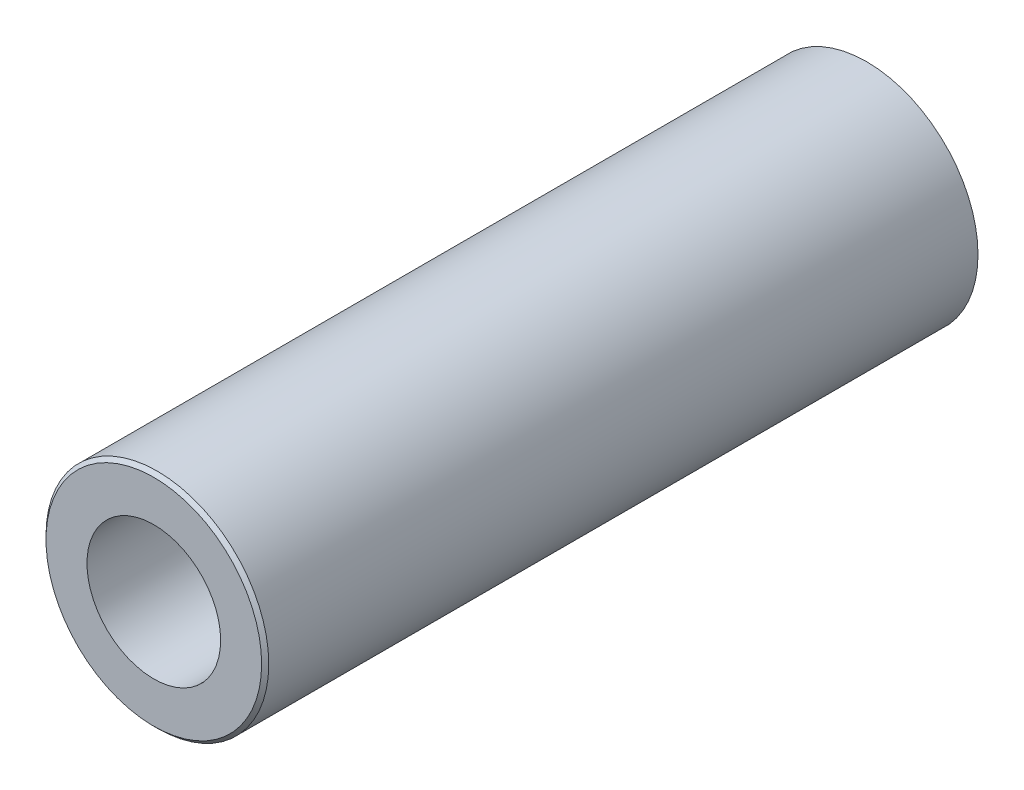
ISO-10303-21;
HEADER;
FILE_DESCRIPTION(('STEP AP214'),'2;1');
FILE_NAME('part.step','',(''),(''),'','','');
FILE_SCHEMA(('AUTOMOTIVE_DESIGN { 1 0 10303 214 1 1 1 1 }'));
ENDSEC;
DATA;
#1=APPLICATION_CONTEXT('core data for automotive mechanical design processes');
#2=APPLICATION_PROTOCOL_DEFINITION('international standard','automotive_design',2000,#1);
#3=PRODUCT_CONTEXT('',#1,'mechanical');
#4=PRODUCT('Part','Part','',(#3));
#5=PRODUCT_RELATED_PRODUCT_CATEGORY('part','',(#4));
#6=PRODUCT_DEFINITION_FORMATION('','',#4);
#7=PRODUCT_DEFINITION_CONTEXT('part definition',#1,'design');
#8=PRODUCT_DEFINITION('design','',#6,#7);
#9=PRODUCT_DEFINITION_SHAPE('','',#8);
#10=(LENGTH_UNIT() NAMED_UNIT(*) SI_UNIT(.MILLI.,.METRE.));
#11=(NAMED_UNIT(*) PLANE_ANGLE_UNIT() SI_UNIT($,.RADIAN.));
#12=(NAMED_UNIT(*) SI_UNIT($,.STERADIAN.) SOLID_ANGLE_UNIT());
#13=UNCERTAINTY_MEASURE_WITH_UNIT(LENGTH_MEASURE(1.E-05),#10,'distance_accuracy_value','');
#14=(GEOMETRIC_REPRESENTATION_CONTEXT(3) GLOBAL_UNCERTAINTY_ASSIGNED_CONTEXT((#13)) GLOBAL_UNIT_ASSIGNED_CONTEXT((#10,
#11,#12)) REPRESENTATION_CONTEXT('',''));
#15=CARTESIAN_POINT('',(0.,0.,0.));
#16=DIRECTION('',(0.,0.,1.));
#17=DIRECTION('',(1.,0.,0.));
#18=AXIS2_PLACEMENT_3D('',#15,#16,#17);
#19=CARTESIAN_POINT('',(0.,0.,50.8));
#20=DIRECTION('',(0.,0.,-1.));
#21=DIRECTION('',(-1.,0.,0.));
#22=AXIS2_PLACEMENT_3D('',#19,#20,#21);
#23=CYLINDRICAL_SURFACE('',#22,7.9375);
#24=CARTESIAN_POINT('',(0.,0.,50.546));
#25=DIRECTION('',(0.,0.,1.));
#26=DIRECTION('',(1.,0.,0.));
#27=AXIS2_PLACEMENT_3D('',#24,#25,#26);
#28=CIRCLE('',#27,7.9375);
#29=CARTESIAN_POINT('',(7.9375,0.,50.546));
#30=VERTEX_POINT('',#29);
#31=EDGE_CURVE('E10',#30,#30,#28,.F.);
#32=ORIENTED_EDGE('',*,*,#31,.T.);
#33=EDGE_LOOP('',(#32));
#34=FACE_BOUND('',#33,.T.);
#35=CARTESIAN_POINT('',(0.,0.,0.));
#36=DIRECTION('',(0.,0.,1.));
#37=DIRECTION('',(1.,0.,0.));
#38=AXIS2_PLACEMENT_3D('',#35,#36,#37);
#39=CIRCLE('',#38,7.9375);
#40=CARTESIAN_POINT('',(7.9375,0.,0.));
#41=VERTEX_POINT('',#40);
#42=EDGE_CURVE('E44',#41,#41,#39,.T.);
#43=ORIENTED_EDGE('',*,*,#42,.T.);
#44=EDGE_LOOP('',(#43));
#45=FACE_BOUND('',#44,.T.);
#46=ADVANCED_FACE('F33',(#34,#45),#23,.T.);
#47=CARTESIAN_POINT('',(0.,0.,50.8));
#48=DIRECTION('',(0.,0.,1.));
#49=DIRECTION('',(1.,0.,0.));
#50=AXIS2_PLACEMENT_3D('',#47,#48,#49);
#51=PLANE('',#50);
#52=CARTESIAN_POINT('',(0.,0.,50.8));
#53=DIRECTION('',(0.,0.,1.));
#54=DIRECTION('',(1.,0.,0.));
#55=AXIS2_PLACEMENT_3D('',#52,#53,#54);
#56=CIRCLE('',#55,4.7625);
#57=CARTESIAN_POINT('',(4.7625,0.,50.8));
#58=VERTEX_POINT('',#57);
#59=EDGE_CURVE('E53',#58,#58,#56,.T.);
#60=ORIENTED_EDGE('',*,*,#59,.F.);
#61=EDGE_LOOP('',(#60));
#62=FACE_BOUND('',#61,.T.);
#63=CARTESIAN_POINT('',(0.,0.,50.8));
#64=DIRECTION('',(0.,0.,1.));
#65=DIRECTION('',(1.,0.,0.));
#66=AXIS2_PLACEMENT_3D('',#63,#64,#65);
#67=CIRCLE('',#66,7.6835);
#68=CARTESIAN_POINT('',(7.6835,0.,50.8));
#69=VERTEX_POINT('',#68);
#70=EDGE_CURVE('E40',#69,#69,#67,.T.);
#71=ORIENTED_EDGE('',*,*,#70,.T.);
#72=EDGE_LOOP('',(#71));
#73=FACE_BOUND('',#72,.T.);
#74=ADVANCED_FACE('F59',(#62,#73),#51,.T.);
#75=CARTESIAN_POINT('',(0.,0.,0.));
#76=DIRECTION('',(0.,0.,1.));
#77=DIRECTION('',(1.,0.,0.));
#78=AXIS2_PLACEMENT_3D('',#75,#76,#77);
#79=PLANE('',#78);
#80=CARTESIAN_POINT('',(0.,0.,0.));
#81=DIRECTION('',(0.,0.,1.));
#82=DIRECTION('',(1.,0.,0.));
#83=AXIS2_PLACEMENT_3D('',#80,#81,#82);
#84=CIRCLE('',#83,4.76249999999999);
#85=CARTESIAN_POINT('',(4.76249999999999,0.,0.));
#86=VERTEX_POINT('',#85);
#87=EDGE_CURVE('E48',#86,#86,#84,.T.);
#88=ORIENTED_EDGE('',*,*,#87,.T.);
#89=EDGE_LOOP('',(#88));
#90=FACE_BOUND('',#89,.T.);
#91=ORIENTED_EDGE('',*,*,#42,.F.);
#92=EDGE_LOOP('',(#91));
#93=FACE_BOUND('',#92,.T.);
#94=ADVANCED_FACE('F61',(#90,#93),#79,.F.);
#95=CARTESIAN_POINT('',(0.,0.,50.8));
#96=DIRECTION('',(0.,0.,-1.));
#97=DIRECTION('',(-1.,0.,0.));
#98=AXIS2_PLACEMENT_3D('',#95,#96,#97);
#99=CONICAL_SURFACE('',#98,7.6835,0.785398163397435);
#100=ORIENTED_EDGE('',*,*,#31,.F.);
#101=EDGE_LOOP('',(#100));
#102=FACE_BOUND('',#101,.T.);
#103=ORIENTED_EDGE('',*,*,#70,.F.);
#104=EDGE_LOOP('',(#103));
#105=FACE_BOUND('',#104,.T.);
#106=ADVANCED_FACE('F35',(#102,#105),#99,.T.);
#107=CARTESIAN_POINT('',(0.,0.,50.8));
#108=DIRECTION('',(0.,0.,1.));
#109=DIRECTION('',(1.,0.,0.));
#110=AXIS2_PLACEMENT_3D('',#107,#108,#109);
#111=CYLINDRICAL_SURFACE('',#110,4.76249999999999);
#112=ORIENTED_EDGE('',*,*,#87,.F.);
#113=EDGE_LOOP('',(#112));
#114=FACE_BOUND('',#113,.T.);
#115=ORIENTED_EDGE('',*,*,#59,.T.);
#116=EDGE_LOOP('',(#115));
#117=FACE_BOUND('',#116,.T.);
#118=ADVANCED_FACE('F57',(#114,#117),#111,.F.);
#119=CLOSED_SHELL('',(#46,#74,#94,#106,#118));
#120=MANIFOLD_SOLID_BREP('B2',#119);
#121=ADVANCED_BREP_SHAPE_REPRESENTATION('',(#18,#120),#14);
#122=SHAPE_DEFINITION_REPRESENTATION(#9,#121);
ENDSEC;
END-ISO-10303-21;
